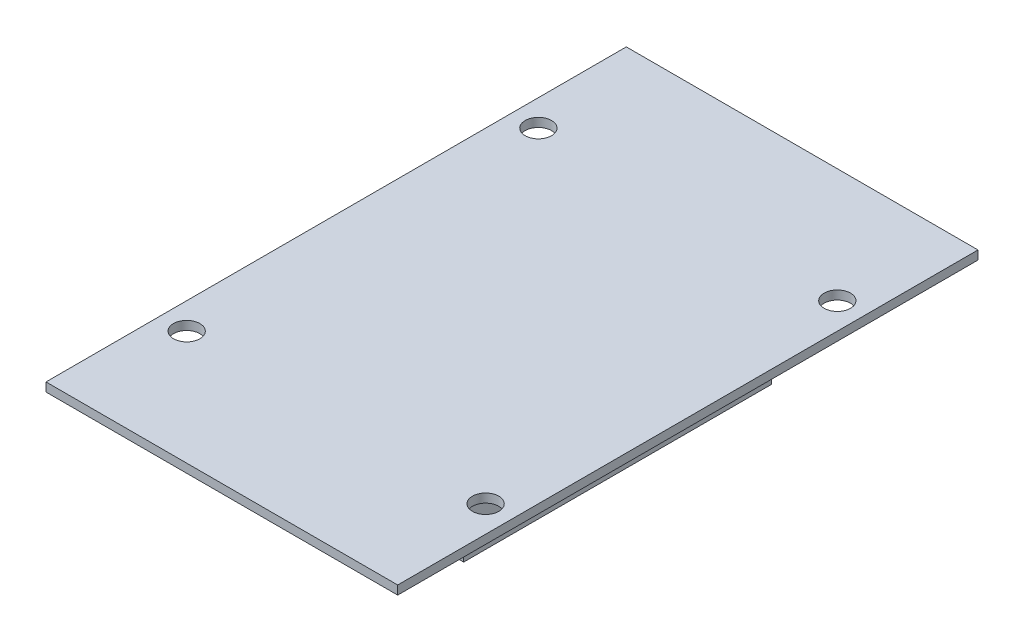
ISO-10303-21;
HEADER;
FILE_DESCRIPTION(('STEP AP214'),'2;1');
FILE_NAME('part.step','',(''),(''),'','','');
FILE_SCHEMA(('AUTOMOTIVE_DESIGN { 1 0 10303 214 1 1 1 1 }'));
ENDSEC;
DATA;
#1=APPLICATION_CONTEXT('core data for automotive mechanical design processes');
#2=APPLICATION_PROTOCOL_DEFINITION('international standard','automotive_design',2000,#1);
#3=PRODUCT_CONTEXT('',#1,'mechanical');
#4=PRODUCT('Part','Part','',(#3));
#5=PRODUCT_RELATED_PRODUCT_CATEGORY('part','',(#4));
#6=PRODUCT_DEFINITION_FORMATION('','',#4);
#7=PRODUCT_DEFINITION_CONTEXT('part definition',#1,'design');
#8=PRODUCT_DEFINITION('design','',#6,#7);
#9=PRODUCT_DEFINITION_SHAPE('','',#8);
#10=(LENGTH_UNIT() NAMED_UNIT(*) SI_UNIT(.MILLI.,.METRE.));
#11=(NAMED_UNIT(*) PLANE_ANGLE_UNIT() SI_UNIT($,.RADIAN.));
#12=(NAMED_UNIT(*) SI_UNIT($,.STERADIAN.) SOLID_ANGLE_UNIT());
#13=UNCERTAINTY_MEASURE_WITH_UNIT(LENGTH_MEASURE(1.E-05),#10,'distance_accuracy_value','');
#14=(GEOMETRIC_REPRESENTATION_CONTEXT(3) GLOBAL_UNCERTAINTY_ASSIGNED_CONTEXT((#13)) GLOBAL_UNIT_ASSIGNED_CONTEXT((#10,
#11,#12)) REPRESENTATION_CONTEXT('',''));
#15=CARTESIAN_POINT('',(0.,0.,0.));
#16=DIRECTION('',(0.,0.,1.));
#17=DIRECTION('',(1.,0.,0.));
#18=AXIS2_PLACEMENT_3D('',#15,#16,#17);
#19=CARTESIAN_POINT('',(0.,0.,66.));
#20=DIRECTION('',(0.,1.,0.));
#21=DIRECTION('',(0.,0.,1.));
#22=AXIS2_PLACEMENT_3D('',#19,#20,#21);
#23=PLANE('',#22);
#24=CARTESIAN_POINT('',(37.,0.,13.));
#25=DIRECTION('',(0.,1.,0.));
#26=DIRECTION('',(0.,0.,1.));
#27=AXIS2_PLACEMENT_3D('',#24,#25,#26);
#28=CIRCLE('',#27,1.5);
#29=CARTESIAN_POINT('',(37.,0.,14.5));
#30=VERTEX_POINT('',#29);
#31=EDGE_CURVE('E258',#30,#30,#28,.T.);
#32=ORIENTED_EDGE('',*,*,#31,.T.);
#33=EDGE_LOOP('',(#32));
#34=FACE_BOUND('',#33,.T.);
#35=CARTESIAN_POINT('',(3.,0.,53.));
#36=DIRECTION('',(0.,1.,0.));
#37=DIRECTION('',(0.,0.,1.));
#38=AXIS2_PLACEMENT_3D('',#35,#36,#37);
#39=CIRCLE('',#38,1.5);
#40=CARTESIAN_POINT('',(3.,0.,54.5));
#41=VERTEX_POINT('',#40);
#42=EDGE_CURVE('E252',#41,#41,#39,.T.);
#43=ORIENTED_EDGE('',*,*,#42,.T.);
#44=EDGE_LOOP('',(#43));
#45=FACE_BOUND('',#44,.T.);
#46=CARTESIAN_POINT('',(37.,0.,53.));
#47=DIRECTION('',(0.,1.,0.));
#48=DIRECTION('',(0.,0.,1.));
#49=AXIS2_PLACEMENT_3D('',#46,#47,#48);
#50=CIRCLE('',#49,1.5);
#51=CARTESIAN_POINT('',(37.,0.,54.5));
#52=VERTEX_POINT('',#51);
#53=EDGE_CURVE('E249',#52,#52,#50,.T.);
#54=ORIENTED_EDGE('',*,*,#53,.T.);
#55=EDGE_LOOP('',(#54));
#56=FACE_BOUND('',#55,.T.);
#57=CARTESIAN_POINT('',(2.99999999999999,0.,13.));
#58=DIRECTION('',(0.,1.,0.));
#59=DIRECTION('',(0.,0.,1.));
#60=AXIS2_PLACEMENT_3D('',#57,#58,#59);
#61=CIRCLE('',#60,1.5);
#62=CARTESIAN_POINT('',(2.99999999999999,0.,14.5));
#63=VERTEX_POINT('',#62);
#64=EDGE_CURVE('E253',#63,#63,#61,.T.);
#65=ORIENTED_EDGE('',*,*,#64,.T.);
#66=EDGE_LOOP('',(#65));
#67=FACE_BOUND('',#66,.T.);
#68=DIRECTION('',(1.,0.,0.));
#69=VECTOR('',#68,1.);
#70=CARTESIAN_POINT('',(0.,0.,0.));
#71=LINE('',#70,#69);
#72=CARTESIAN_POINT('',(0.,0.,0.));
#73=VERTEX_POINT('',#72);
#74=CARTESIAN_POINT('',(40.,0.,0.));
#75=VERTEX_POINT('',#74);
#76=EDGE_CURVE('E139',#73,#75,#71,.T.);
#77=ORIENTED_EDGE('',*,*,#76,.T.);
#78=DIRECTION('',(0.,0.,-1.));
#79=VECTOR('',#78,1.);
#80=CARTESIAN_POINT('',(40.,0.,66.));
#81=LINE('',#80,#79);
#82=CARTESIAN_POINT('',(40.,0.,66.));
#83=VERTEX_POINT('',#82);
#84=EDGE_CURVE('E54',#83,#75,#81,.T.);
#85=ORIENTED_EDGE('',*,*,#84,.F.);
#86=DIRECTION('',(1.,0.,0.));
#87=VECTOR('',#86,1.);
#88=CARTESIAN_POINT('',(0.,0.,66.));
#89=LINE('',#88,#87);
#90=CARTESIAN_POINT('',(0.,0.,66.));
#91=VERTEX_POINT('',#90);
#92=EDGE_CURVE('E149',#91,#83,#89,.T.);
#93=ORIENTED_EDGE('',*,*,#92,.F.);
#94=DIRECTION('',(0.,0.,-1.));
#95=VECTOR('',#94,1.);
#96=CARTESIAN_POINT('',(0.,0.,66.));
#97=LINE('',#96,#95);
#98=EDGE_CURVE('E11',#91,#73,#97,.T.);
#99=ORIENTED_EDGE('',*,*,#98,.T.);
#100=EDGE_LOOP('',(#77,#85,#93,#99));
#101=FACE_BOUND('',#100,.T.);
#102=DIRECTION('',(0.,0.,1.));
#103=VECTOR('',#102,1.);
#104=CARTESIAN_POINT('',(32.,0.,15.5));
#105=LINE('',#104,#103);
#106=CARTESIAN_POINT('',(32.,0.,15.5));
#107=VERTEX_POINT('',#106);
#108=CARTESIAN_POINT('',(32.,0.,50.5));
#109=VERTEX_POINT('',#108);
#110=EDGE_CURVE('E61',#107,#109,#105,.T.);
#111=ORIENTED_EDGE('',*,*,#110,.F.);
#112=DIRECTION('',(1.,0.,0.));
#113=VECTOR('',#112,1.);
#114=CARTESIAN_POINT('',(8.00000000000001,0.,15.5));
#115=LINE('',#114,#113);
#116=CARTESIAN_POINT('',(8.00000000000001,0.,15.5));
#117=VERTEX_POINT('',#116);
#118=EDGE_CURVE('E65',#117,#107,#115,.T.);
#119=ORIENTED_EDGE('',*,*,#118,.F.);
#120=DIRECTION('',(0.,0.,-1.));
#121=VECTOR('',#120,1.);
#122=CARTESIAN_POINT('',(8.00000000000001,0.,15.5));
#123=LINE('',#122,#121);
#124=CARTESIAN_POINT('',(8.00000000000001,0.,50.5));
#125=VERTEX_POINT('',#124);
#126=EDGE_CURVE('E277',#125,#117,#123,.T.);
#127=ORIENTED_EDGE('',*,*,#126,.F.);
#128=DIRECTION('',(-1.,0.,0.));
#129=VECTOR('',#128,1.);
#130=CARTESIAN_POINT('',(8.00000000000001,0.,50.5));
#131=LINE('',#130,#129);
#132=EDGE_CURVE('E274',#109,#125,#131,.T.);
#133=ORIENTED_EDGE('',*,*,#132,.F.);
#134=EDGE_LOOP('',(#111,#119,#127,#133));
#135=FACE_BOUND('',#134,.T.);
#136=ADVANCED_FACE('F45',(#34,#45,#56,#67,#101,#135),#23,.F.);
#137=CARTESIAN_POINT('',(0.,0.,66.));
#138=DIRECTION('',(1.,0.,0.));
#139=DIRECTION('',(0.,0.,-1.));
#140=AXIS2_PLACEMENT_3D('',#137,#138,#139);
#141=PLANE('',#140);
#142=DIRECTION('',(0.,-1.,0.));
#143=VECTOR('',#142,1.);
#144=CARTESIAN_POINT('',(0.,0.,0.));
#145=LINE('',#144,#143);
#146=CARTESIAN_POINT('',(0.,0.999999999999999,0.));
#147=VERTEX_POINT('',#146);
#148=EDGE_CURVE('E134',#147,#73,#145,.T.);
#149=ORIENTED_EDGE('',*,*,#148,.T.);
#150=ORIENTED_EDGE('',*,*,#98,.F.);
#151=DIRECTION('',(0.,-1.,0.));
#152=VECTOR('',#151,1.);
#153=CARTESIAN_POINT('',(0.,0.,66.));
#154=LINE('',#153,#152);
#155=CARTESIAN_POINT('',(0.,0.999999999999999,66.));
#156=VERTEX_POINT('',#155);
#157=EDGE_CURVE('E145',#156,#91,#154,.T.);
#158=ORIENTED_EDGE('',*,*,#157,.F.);
#159=DIRECTION('',(0.,0.,-1.));
#160=VECTOR('',#159,1.);
#161=CARTESIAN_POINT('',(0.,0.999999999999999,66.));
#162=LINE('',#161,#160);
#163=EDGE_CURVE('E158',#156,#147,#162,.T.);
#164=ORIENTED_EDGE('',*,*,#163,.T.);
#165=EDGE_LOOP('',(#149,#150,#158,#164));
#166=FACE_BOUND('',#165,.T.);
#167=ADVANCED_FACE('F47',(#166),#141,.F.);
#168=CARTESIAN_POINT('',(40.,0.,66.));
#169=DIRECTION('',(-1.,0.,0.));
#170=DIRECTION('',(0.,0.,1.));
#171=AXIS2_PLACEMENT_3D('',#168,#169,#170);
#172=PLANE('',#171);
#173=DIRECTION('',(0.,1.,0.));
#174=VECTOR('',#173,1.);
#175=CARTESIAN_POINT('',(40.,0.,0.));
#176=LINE('',#175,#174);
#177=CARTESIAN_POINT('',(40.,1.,0.));
#178=VERTEX_POINT('',#177);
#179=EDGE_CURVE('E162',#75,#178,#176,.T.);
#180=ORIENTED_EDGE('',*,*,#179,.T.);
#181=DIRECTION('',(0.,0.,-1.));
#182=VECTOR('',#181,1.);
#183=CARTESIAN_POINT('',(40.,1.,66.));
#184=LINE('',#183,#182);
#185=CARTESIAN_POINT('',(40.,1.,66.));
#186=VERTEX_POINT('',#185);
#187=EDGE_CURVE('E170',#186,#178,#184,.T.);
#188=ORIENTED_EDGE('',*,*,#187,.F.);
#189=DIRECTION('',(0.,1.,0.));
#190=VECTOR('',#189,1.);
#191=CARTESIAN_POINT('',(40.,0.,66.));
#192=LINE('',#191,#190);
#193=EDGE_CURVE('E153',#83,#186,#192,.T.);
#194=ORIENTED_EDGE('',*,*,#193,.F.);
#195=ORIENTED_EDGE('',*,*,#84,.T.);
#196=EDGE_LOOP('',(#180,#188,#194,#195));
#197=FACE_BOUND('',#196,.T.);
#198=ADVANCED_FACE('F179',(#197),#172,.F.);
#199=CARTESIAN_POINT('',(0.,0.999999999999999,66.));
#200=DIRECTION('',(0.,-1.,0.));
#201=DIRECTION('',(1.,0.,0.));
#202=AXIS2_PLACEMENT_3D('',#199,#200,#201);
#203=PLANE('',#202);
#204=CARTESIAN_POINT('',(37.,1.,13.));
#205=DIRECTION('',(0.,1.,0.));
#206=DIRECTION('',(-1.,0.,0.));
#207=AXIS2_PLACEMENT_3D('',#204,#205,#206);
#208=CIRCLE('',#207,1.5);
#209=CARTESIAN_POINT('',(35.5,1.,13.));
#210=VERTEX_POINT('',#209);
#211=EDGE_CURVE('E291',#210,#210,#208,.T.);
#212=ORIENTED_EDGE('',*,*,#211,.F.);
#213=EDGE_LOOP('',(#212));
#214=FACE_BOUND('',#213,.T.);
#215=CARTESIAN_POINT('',(3.,0.999999999999999,53.));
#216=DIRECTION('',(0.,1.,0.));
#217=DIRECTION('',(-1.,0.,0.));
#218=AXIS2_PLACEMENT_3D('',#215,#216,#217);
#219=CIRCLE('',#218,1.5);
#220=CARTESIAN_POINT('',(1.49999999999999,0.999999999999999,53.));
#221=VERTEX_POINT('',#220);
#222=EDGE_CURVE('E292',#221,#221,#219,.T.);
#223=ORIENTED_EDGE('',*,*,#222,.F.);
#224=EDGE_LOOP('',(#223));
#225=FACE_BOUND('',#224,.T.);
#226=CARTESIAN_POINT('',(37.,1.,53.));
#227=DIRECTION('',(0.,1.,0.));
#228=DIRECTION('',(-1.,0.,0.));
#229=AXIS2_PLACEMENT_3D('',#226,#227,#228);
#230=CIRCLE('',#229,1.5);
#231=CARTESIAN_POINT('',(35.5,1.,53.));
#232=VERTEX_POINT('',#231);
#233=EDGE_CURVE('E246',#232,#232,#230,.T.);
#234=ORIENTED_EDGE('',*,*,#233,.F.);
#235=EDGE_LOOP('',(#234));
#236=FACE_BOUND('',#235,.T.);
#237=CARTESIAN_POINT('',(2.99999999999999,0.999999999999999,13.));
#238=DIRECTION('',(0.,1.,0.));
#239=DIRECTION('',(-1.,0.,0.));
#240=AXIS2_PLACEMENT_3D('',#237,#238,#239);
#241=CIRCLE('',#240,1.5);
#242=CARTESIAN_POINT('',(1.49999999999999,0.999999999999999,13.));
#243=VERTEX_POINT('',#242);
#244=EDGE_CURVE('E261',#243,#243,#241,.T.);
#245=ORIENTED_EDGE('',*,*,#244,.F.);
#246=EDGE_LOOP('',(#245));
#247=FACE_BOUND('',#246,.T.);
#248=DIRECTION('',(-1.,0.,0.));
#249=VECTOR('',#248,1.);
#250=CARTESIAN_POINT('',(0.,0.999999999999999,0.));
#251=LINE('',#250,#249);
#252=EDGE_CURVE('E150',#178,#147,#251,.T.);
#253=ORIENTED_EDGE('',*,*,#252,.T.);
#254=ORIENTED_EDGE('',*,*,#163,.F.);
#255=DIRECTION('',(-1.,0.,0.));
#256=VECTOR('',#255,1.);
#257=CARTESIAN_POINT('',(0.,0.999999999999999,66.));
#258=LINE('',#257,#256);
#259=EDGE_CURVE('E156',#186,#156,#258,.T.);
#260=ORIENTED_EDGE('',*,*,#259,.F.);
#261=ORIENTED_EDGE('',*,*,#187,.T.);
#262=EDGE_LOOP('',(#253,#254,#260,#261));
#263=FACE_BOUND('',#262,.T.);
#264=ADVANCED_FACE('F188',(#214,#225,#236,#247,#263),#203,.F.);
#265=CARTESIAN_POINT('',(0.,0.,66.));
#266=DIRECTION('',(0.,0.,-1.));
#267=DIRECTION('',(-1.,0.,0.));
#268=AXIS2_PLACEMENT_3D('',#265,#266,#267);
#269=PLANE('',#268);
#270=ORIENTED_EDGE('',*,*,#157,.T.);
#271=ORIENTED_EDGE('',*,*,#92,.T.);
#272=ORIENTED_EDGE('',*,*,#193,.T.);
#273=ORIENTED_EDGE('',*,*,#259,.T.);
#274=EDGE_LOOP('',(#270,#271,#272,#273));
#275=FACE_BOUND('',#274,.T.);
#276=ADVANCED_FACE('F194',(#275),#269,.F.);
#277=CARTESIAN_POINT('',(0.,0.,0.));
#278=DIRECTION('',(0.,0.,-1.));
#279=DIRECTION('',(-1.,0.,0.));
#280=AXIS2_PLACEMENT_3D('',#277,#278,#279);
#281=PLANE('',#280);
#282=ORIENTED_EDGE('',*,*,#148,.F.);
#283=ORIENTED_EDGE('',*,*,#252,.F.);
#284=ORIENTED_EDGE('',*,*,#179,.F.);
#285=ORIENTED_EDGE('',*,*,#76,.F.);
#286=EDGE_LOOP('',(#282,#283,#284,#285));
#287=FACE_BOUND('',#286,.T.);
#288=ADVANCED_FACE('F185',(#287),#281,.T.);
#289=CARTESIAN_POINT('',(32.,-8.5,15.5));
#290=DIRECTION('',(-1.,0.,0.));
#291=DIRECTION('',(0.,0.,1.));
#292=AXIS2_PLACEMENT_3D('',#289,#290,#291);
#293=PLANE('',#292);
#294=ORIENTED_EDGE('',*,*,#110,.T.);
#295=DIRECTION('',(0.,1.,0.));
#296=VECTOR('',#295,1.);
#297=CARTESIAN_POINT('',(32.,-8.5,50.5));
#298=LINE('',#297,#296);
#299=CARTESIAN_POINT('',(32.,-8.5,50.5));
#300=VERTEX_POINT('',#299);
#301=EDGE_CURVE('E114',#300,#109,#298,.T.);
#302=ORIENTED_EDGE('',*,*,#301,.F.);
#303=DIRECTION('',(0.,0.,1.));
#304=VECTOR('',#303,1.);
#305=CARTESIAN_POINT('',(32.,-8.5,15.5));
#306=LINE('',#305,#304);
#307=CARTESIAN_POINT('',(32.,-8.5,15.5));
#308=VERTEX_POINT('',#307);
#309=EDGE_CURVE('E121',#308,#300,#306,.T.);
#310=ORIENTED_EDGE('',*,*,#309,.F.);
#311=DIRECTION('',(0.,1.,0.));
#312=VECTOR('',#311,1.);
#313=CARTESIAN_POINT('',(32.,-8.5,15.5));
#314=LINE('',#313,#312);
#315=EDGE_CURVE('E271',#308,#107,#314,.T.);
#316=ORIENTED_EDGE('',*,*,#315,.T.);
#317=EDGE_LOOP('',(#294,#302,#310,#316));
#318=FACE_BOUND('',#317,.T.);
#319=ADVANCED_FACE('F132',(#318),#293,.F.);
#320=CARTESIAN_POINT('',(8.00000000000001,-8.5,50.5));
#321=DIRECTION('',(0.,0.,-1.));
#322=DIRECTION('',(-1.,0.,0.));
#323=AXIS2_PLACEMENT_3D('',#320,#321,#322);
#324=PLANE('',#323);
#325=ORIENTED_EDGE('',*,*,#132,.T.);
#326=DIRECTION('',(0.,1.,0.));
#327=VECTOR('',#326,1.);
#328=CARTESIAN_POINT('',(8.00000000000001,-8.5,50.5));
#329=LINE('',#328,#327);
#330=CARTESIAN_POINT('',(8.00000000000001,-8.5,50.5));
#331=VERTEX_POINT('',#330);
#332=EDGE_CURVE('E116',#331,#125,#329,.T.);
#333=ORIENTED_EDGE('',*,*,#332,.F.);
#334=DIRECTION('',(-1.,0.,0.));
#335=VECTOR('',#334,1.);
#336=CARTESIAN_POINT('',(8.00000000000001,-8.5,50.5));
#337=LINE('',#336,#335);
#338=EDGE_CURVE('E109',#300,#331,#337,.T.);
#339=ORIENTED_EDGE('',*,*,#338,.F.);
#340=ORIENTED_EDGE('',*,*,#301,.T.);
#341=EDGE_LOOP('',(#325,#333,#339,#340));
#342=FACE_BOUND('',#341,.T.);
#343=ADVANCED_FACE('F112',(#342),#324,.F.);
#344=CARTESIAN_POINT('',(8.00000000000001,-8.5,15.5));
#345=DIRECTION('',(1.,0.,0.));
#346=DIRECTION('',(0.,0.,-1.));
#347=AXIS2_PLACEMENT_3D('',#344,#345,#346);
#348=PLANE('',#347);
#349=ORIENTED_EDGE('',*,*,#126,.T.);
#350=DIRECTION('',(0.,1.,0.));
#351=VECTOR('',#350,1.);
#352=CARTESIAN_POINT('',(8.00000000000001,-8.5,15.5));
#353=LINE('',#352,#351);
#354=CARTESIAN_POINT('',(8.00000000000001,-8.5,15.5));
#355=VERTEX_POINT('',#354);
#356=EDGE_CURVE('E141',#355,#117,#353,.T.);
#357=ORIENTED_EDGE('',*,*,#356,.F.);
#358=DIRECTION('',(0.,0.,-1.));
#359=VECTOR('',#358,1.);
#360=CARTESIAN_POINT('',(8.00000000000001,-8.5,15.5));
#361=LINE('',#360,#359);
#362=EDGE_CURVE('E120',#331,#355,#361,.T.);
#363=ORIENTED_EDGE('',*,*,#362,.F.);
#364=ORIENTED_EDGE('',*,*,#332,.T.);
#365=EDGE_LOOP('',(#349,#357,#363,#364));
#366=FACE_BOUND('',#365,.T.);
#367=ADVANCED_FACE('F217',(#366),#348,.F.);
#368=CARTESIAN_POINT('',(8.00000000000001,-8.5,15.5));
#369=DIRECTION('',(0.,0.,1.));
#370=DIRECTION('',(1.,0.,0.));
#371=AXIS2_PLACEMENT_3D('',#368,#369,#370);
#372=PLANE('',#371);
#373=ORIENTED_EDGE('',*,*,#118,.T.);
#374=ORIENTED_EDGE('',*,*,#315,.F.);
#375=DIRECTION('',(1.,0.,0.));
#376=VECTOR('',#375,1.);
#377=CARTESIAN_POINT('',(8.00000000000001,-8.5,15.5));
#378=LINE('',#377,#376);
#379=EDGE_CURVE('E126',#355,#308,#378,.T.);
#380=ORIENTED_EDGE('',*,*,#379,.F.);
#381=ORIENTED_EDGE('',*,*,#356,.T.);
#382=EDGE_LOOP('',(#373,#374,#380,#381));
#383=FACE_BOUND('',#382,.T.);
#384=ADVANCED_FACE('F220',(#383),#372,.F.);
#385=CARTESIAN_POINT('',(0.,-8.5,0.));
#386=DIRECTION('',(0.,1.,0.));
#387=DIRECTION('',(0.,0.,1.));
#388=AXIS2_PLACEMENT_3D('',#385,#386,#387);
#389=PLANE('',#388);
#390=ORIENTED_EDGE('',*,*,#309,.T.);
#391=ORIENTED_EDGE('',*,*,#338,.T.);
#392=ORIENTED_EDGE('',*,*,#362,.T.);
#393=ORIENTED_EDGE('',*,*,#379,.T.);
#394=EDGE_LOOP('',(#390,#391,#392,#393));
#395=FACE_BOUND('',#394,.T.);
#396=ADVANCED_FACE('F124',(#395),#389,.F.);
#397=CARTESIAN_POINT('',(2.99999999999999,-8.5,13.));
#398=DIRECTION('',(0.,1.,0.));
#399=DIRECTION('',(-1.,0.,0.));
#400=AXIS2_PLACEMENT_3D('',#397,#398,#399);
#401=CYLINDRICAL_SURFACE('',#400,1.5);
#402=ORIENTED_EDGE('',*,*,#244,.T.);
#403=EDGE_LOOP('',(#402));
#404=FACE_BOUND('',#403,.T.);
#405=ORIENTED_EDGE('',*,*,#64,.F.);
#406=EDGE_LOOP('',(#405));
#407=FACE_BOUND('',#406,.T.);
#408=ADVANCED_FACE('F226',(#404,#407),#401,.F.);
#409=CARTESIAN_POINT('',(37.,-8.5,53.));
#410=DIRECTION('',(0.,1.,0.));
#411=DIRECTION('',(-1.,0.,0.));
#412=AXIS2_PLACEMENT_3D('',#409,#410,#411);
#413=CYLINDRICAL_SURFACE('',#412,1.5);
#414=ORIENTED_EDGE('',*,*,#233,.T.);
#415=EDGE_LOOP('',(#414));
#416=FACE_BOUND('',#415,.T.);
#417=ORIENTED_EDGE('',*,*,#53,.F.);
#418=EDGE_LOOP('',(#417));
#419=FACE_BOUND('',#418,.T.);
#420=ADVANCED_FACE('F229',(#416,#419),#413,.F.);
#421=CARTESIAN_POINT('',(3.,-8.5,53.));
#422=DIRECTION('',(0.,1.,0.));
#423=DIRECTION('',(-1.,0.,0.));
#424=AXIS2_PLACEMENT_3D('',#421,#422,#423);
#425=CYLINDRICAL_SURFACE('',#424,1.5);
#426=ORIENTED_EDGE('',*,*,#222,.T.);
#427=EDGE_LOOP('',(#426));
#428=FACE_BOUND('',#427,.T.);
#429=ORIENTED_EDGE('',*,*,#42,.F.);
#430=EDGE_LOOP('',(#429));
#431=FACE_BOUND('',#430,.T.);
#432=ADVANCED_FACE('F231',(#428,#431),#425,.F.);
#433=CARTESIAN_POINT('',(37.,-8.5,13.));
#434=DIRECTION('',(0.,1.,0.));
#435=DIRECTION('',(-1.,0.,0.));
#436=AXIS2_PLACEMENT_3D('',#433,#434,#435);
#437=CYLINDRICAL_SURFACE('',#436,1.5);
#438=ORIENTED_EDGE('',*,*,#211,.T.);
#439=EDGE_LOOP('',(#438));
#440=FACE_BOUND('',#439,.T.);
#441=ORIENTED_EDGE('',*,*,#31,.F.);
#442=EDGE_LOOP('',(#441));
#443=FACE_BOUND('',#442,.T.);
#444=ADVANCED_FACE('F234',(#440,#443),#437,.F.);
#445=CLOSED_SHELL('',(#136,#167,#198,#264,#276,#288,#319,#343,#367,#384,#396,#408,#420,#432,#444));
#446=MANIFOLD_SOLID_BREP('B2',#445);
#447=ADVANCED_BREP_SHAPE_REPRESENTATION('',(#18,#446),#14);
#448=SHAPE_DEFINITION_REPRESENTATION(#9,#447);
ENDSEC;
END-ISO-10303-21;
